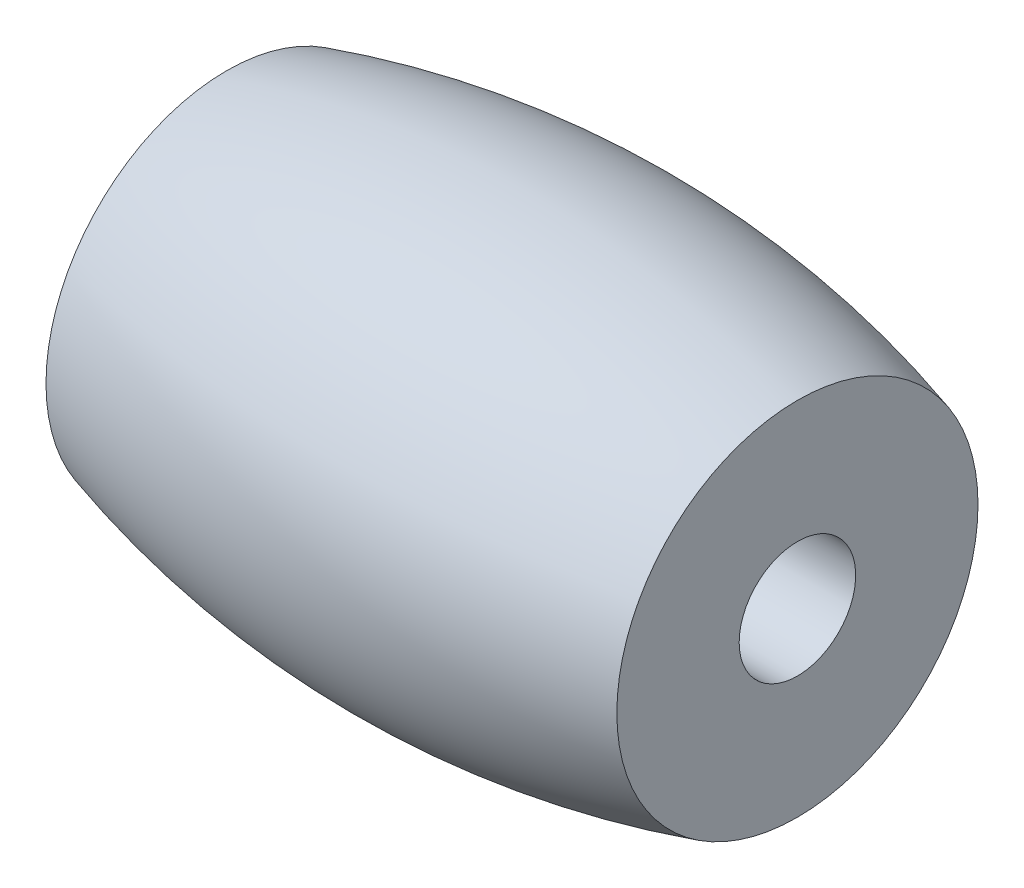
ISO-10303-21;
HEADER;
FILE_DESCRIPTION(('STEP AP214'),'2;1');
FILE_NAME('part.step','',(''),(''),'','','');
FILE_SCHEMA(('AUTOMOTIVE_DESIGN { 1 0 10303 214 1 1 1 1 }'));
ENDSEC;
DATA;
#1=APPLICATION_CONTEXT('core data for automotive mechanical design processes');
#2=APPLICATION_PROTOCOL_DEFINITION('international standard','automotive_design',2000,#1);
#3=PRODUCT_CONTEXT('',#1,'mechanical');
#4=PRODUCT('Part','Part','',(#3));
#5=PRODUCT_RELATED_PRODUCT_CATEGORY('part','',(#4));
#6=PRODUCT_DEFINITION_FORMATION('','',#4);
#7=PRODUCT_DEFINITION_CONTEXT('part definition',#1,'design');
#8=PRODUCT_DEFINITION('design','',#6,#7);
#9=PRODUCT_DEFINITION_SHAPE('','',#8);
#10=(LENGTH_UNIT() NAMED_UNIT(*) SI_UNIT(.MILLI.,.METRE.));
#11=(NAMED_UNIT(*) PLANE_ANGLE_UNIT() SI_UNIT($,.RADIAN.));
#12=(NAMED_UNIT(*) SI_UNIT($,.STERADIAN.) SOLID_ANGLE_UNIT());
#13=UNCERTAINTY_MEASURE_WITH_UNIT(LENGTH_MEASURE(1.E-05),#10,'distance_accuracy_value','');
#14=(GEOMETRIC_REPRESENTATION_CONTEXT(3) GLOBAL_UNCERTAINTY_ASSIGNED_CONTEXT((#13)) GLOBAL_UNIT_ASSIGNED_CONTEXT((#10,
#11,#12)) REPRESENTATION_CONTEXT('',''));
#15=CARTESIAN_POINT('',(0.,0.,0.));
#16=DIRECTION('',(0.,0.,1.));
#17=DIRECTION('',(1.,0.,0.));
#18=AXIS2_PLACEMENT_3D('',#15,#16,#17);
#19=CARTESIAN_POINT('',(-12.25,19.,9.5));
#20=DIRECTION('',(1.,0.,0.));
#21=DIRECTION('',(0.,0.,-1.));
#22=AXIS2_PLACEMENT_3D('',#19,#20,#21);
#23=PLANE('',#22);
#24=CARTESIAN_POINT('',(-12.25,9.5,0.));
#25=DIRECTION('',(-1.,0.,0.));
#26=DIRECTION('',(0.,0.,1.));
#27=AXIS2_PLACEMENT_3D('',#24,#25,#26);
#28=CIRCLE('',#27,2.5);
#29=CARTESIAN_POINT('',(-12.25,9.5,2.5));
#30=VERTEX_POINT('',#29);
#31=EDGE_CURVE('E81',#30,#30,#28,.T.);
#32=ORIENTED_EDGE('',*,*,#31,.F.);
#33=EDGE_LOOP('',(#32));
#34=FACE_BOUND('',#33,.T.);
#35=CARTESIAN_POINT('',(-12.25,9.5,0.));
#36=DIRECTION('',(-1.,0.,0.));
#37=DIRECTION('',(0.,0.,1.));
#38=AXIS2_PLACEMENT_3D('',#35,#36,#37);
#39=CIRCLE('',#38,7.75);
#40=CARTESIAN_POINT('',(-12.25,9.5,7.75));
#41=VERTEX_POINT('',#40);
#42=EDGE_CURVE('E11',#41,#41,#39,.T.);
#43=ORIENTED_EDGE('',*,*,#42,.T.);
#44=EDGE_LOOP('',(#43));
#45=FACE_BOUND('',#44,.T.);
#46=ADVANCED_FACE('F33',(#34,#45),#23,.F.);
#47=CARTESIAN_POINT('',(0.,9.5,0.));
#48=DIRECTION('',(-1.,0.,0.));
#49=DIRECTION('',(0.,0.,1.));
#50=AXIS2_PLACEMENT_3D('',#47,#48,#49);
#51=DEGENERATE_TOROIDAL_SURFACE('',#50,34.2500000000007,43.7500000000007,.F.);
#52=CARTESIAN_POINT('',(0.,9.5,9.49999999999997));
#53=VERTEX_POINT('',#52);
#54=VERTEX_LOOP('',#53);
#55=FACE_BOUND('',#54,.T.);
#56=CARTESIAN_POINT('',(0.,9.5,-9.49999999999997));
#57=VERTEX_POINT('',#56);
#58=VERTEX_LOOP('',#57);
#59=FACE_BOUND('',#58,.T.);
#60=CARTESIAN_POINT('',(0.,19.,0.));
#61=VERTEX_POINT('',#60);
#62=VERTEX_LOOP('',#61);
#63=FACE_BOUND('',#62,.T.);
#64=CARTESIAN_POINT('',(0.,0.,0.));
#65=VERTEX_POINT('',#64);
#66=VERTEX_LOOP('',#65);
#67=FACE_BOUND('',#66,.T.);
#68=CARTESIAN_POINT('',(12.25,9.5,0.));
#69=DIRECTION('',(-1.,0.,0.));
#70=DIRECTION('',(0.,0.,1.));
#71=AXIS2_PLACEMENT_3D('',#68,#69,#70);
#72=CIRCLE('',#71,7.75);
#73=CARTESIAN_POINT('',(12.25,9.5,7.75));
#74=VERTEX_POINT('',#73);
#75=EDGE_CURVE('E42',#74,#74,#72,.T.);
#76=ORIENTED_EDGE('',*,*,#75,.T.);
#77=EDGE_LOOP('',(#76));
#78=FACE_BOUND('',#77,.T.);
#79=ORIENTED_EDGE('',*,*,#42,.F.);
#80=EDGE_LOOP('',(#79));
#81=FACE_BOUND('',#80,.T.);
#82=ADVANCED_FACE('F55',(#55,#59,#63,#67,#78,#81),#51,.F.);
#83=CARTESIAN_POINT('',(12.25,19.,9.5));
#84=DIRECTION('',(-1.,0.,0.));
#85=DIRECTION('',(0.,0.,1.));
#86=AXIS2_PLACEMENT_3D('',#83,#84,#85);
#87=PLANE('',#86);
#88=CARTESIAN_POINT('',(12.25,9.5,0.));
#89=DIRECTION('',(-1.,0.,0.));
#90=DIRECTION('',(0.,0.,1.));
#91=AXIS2_PLACEMENT_3D('',#88,#89,#90);
#92=CIRCLE('',#91,2.5);
#93=CARTESIAN_POINT('',(12.25,9.5,2.5));
#94=VERTEX_POINT('',#93);
#95=EDGE_CURVE('E37',#94,#94,#92,.T.);
#96=ORIENTED_EDGE('',*,*,#95,.T.);
#97=EDGE_LOOP('',(#96));
#98=FACE_BOUND('',#97,.T.);
#99=ORIENTED_EDGE('',*,*,#75,.F.);
#100=EDGE_LOOP('',(#99));
#101=FACE_BOUND('',#100,.T.);
#102=ADVANCED_FACE('F35',(#98,#101),#87,.F.);
#103=CARTESIAN_POINT('',(22.25,9.5,0.));
#104=DIRECTION('',(-1.,0.,0.));
#105=DIRECTION('',(0.,0.,1.));
#106=AXIS2_PLACEMENT_3D('',#103,#104,#105);
#107=CYLINDRICAL_SURFACE('',#106,2.5);
#108=ORIENTED_EDGE('',*,*,#31,.T.);
#109=EDGE_LOOP('',(#108));
#110=FACE_BOUND('',#109,.T.);
#111=ORIENTED_EDGE('',*,*,#95,.F.);
#112=EDGE_LOOP('',(#111));
#113=FACE_BOUND('',#112,.T.);
#114=ADVANCED_FACE('F72',(#110,#113),#107,.F.);
#115=CLOSED_SHELL('',(#46,#82,#102,#114));
#116=MANIFOLD_SOLID_BREP('B2',#115);
#117=ADVANCED_BREP_SHAPE_REPRESENTATION('',(#18,#116),#14);
#118=SHAPE_DEFINITION_REPRESENTATION(#9,#117);
ENDSEC;
END-ISO-10303-21;
